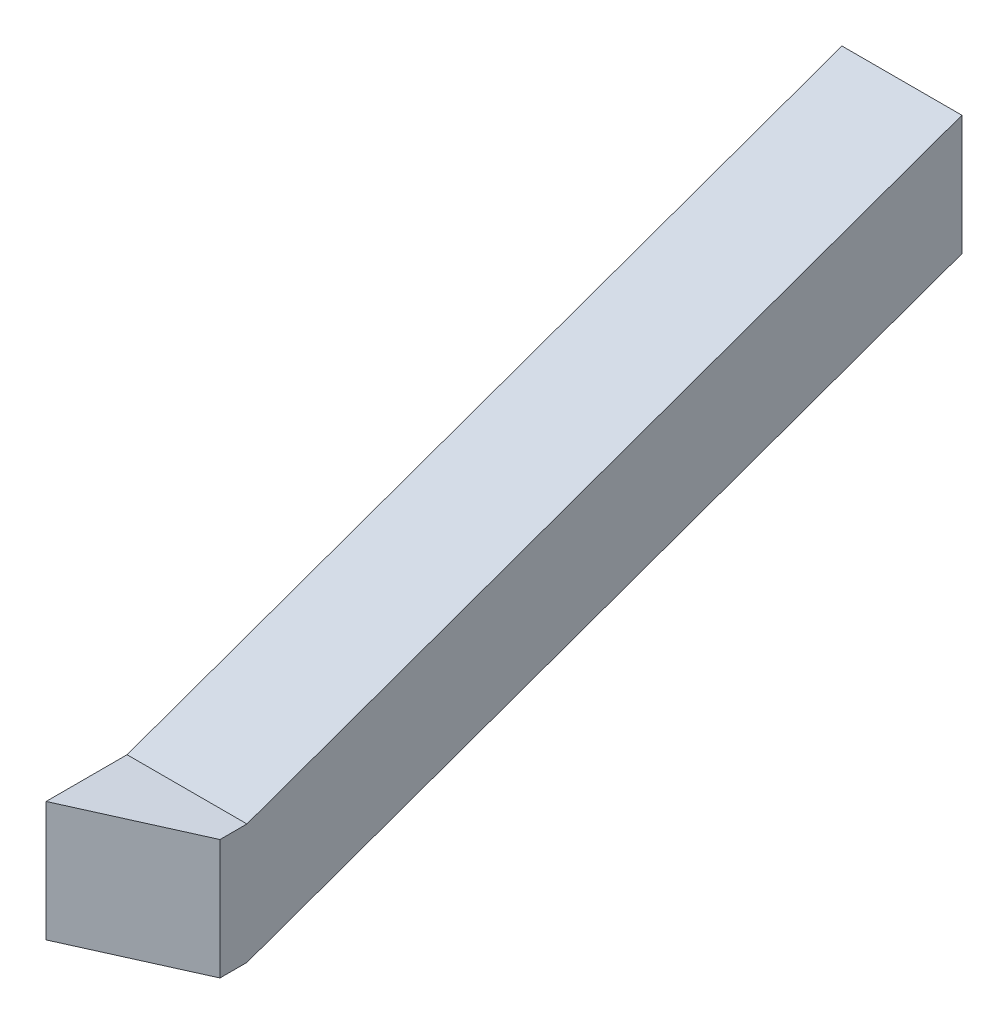
ISO-10303-21;
HEADER;
FILE_DESCRIPTION(('STEP AP214'),'2;1');
FILE_NAME('part.step','',(''),(''),'','','');
FILE_SCHEMA(('AUTOMOTIVE_DESIGN { 1 0 10303 214 1 1 1 1 }'));
ENDSEC;
DATA;
#1=APPLICATION_CONTEXT('core data for automotive mechanical design processes');
#2=APPLICATION_PROTOCOL_DEFINITION('international standard','automotive_design',2000,#1);
#3=PRODUCT_CONTEXT('',#1,'mechanical');
#4=PRODUCT('Part','Part','',(#3));
#5=PRODUCT_RELATED_PRODUCT_CATEGORY('part','',(#4));
#6=PRODUCT_DEFINITION_FORMATION('','',#4);
#7=PRODUCT_DEFINITION_CONTEXT('part definition',#1,'design');
#8=PRODUCT_DEFINITION('design','',#6,#7);
#9=PRODUCT_DEFINITION_SHAPE('','',#8);
#10=(LENGTH_UNIT() NAMED_UNIT(*) SI_UNIT(.MILLI.,.METRE.));
#11=(NAMED_UNIT(*) PLANE_ANGLE_UNIT() SI_UNIT($,.RADIAN.));
#12=(NAMED_UNIT(*) SI_UNIT($,.STERADIAN.) SOLID_ANGLE_UNIT());
#13=UNCERTAINTY_MEASURE_WITH_UNIT(LENGTH_MEASURE(1.E-05),#10,'distance_accuracy_value','');
#14=(GEOMETRIC_REPRESENTATION_CONTEXT(3) GLOBAL_UNCERTAINTY_ASSIGNED_CONTEXT((#13)) GLOBAL_UNIT_ASSIGNED_CONTEXT((#10,
#11,#12)) REPRESENTATION_CONTEXT('',''));
#15=CARTESIAN_POINT('',(0.,0.,0.));
#16=DIRECTION('',(0.,0.,1.));
#17=DIRECTION('',(1.,0.,0.));
#18=AXIS2_PLACEMENT_3D('',#15,#16,#17);
#19=CARTESIAN_POINT('',(0.,0.,-60.));
#20=DIRECTION('',(-1.,0.,0.));
#21=DIRECTION('',(0.,0.,1.));
#22=AXIS2_PLACEMENT_3D('',#19,#20,#21);
#23=PLANE('',#22);
#24=DIRECTION('',(0.,-1.,0.));
#25=VECTOR('',#24,1.);
#26=CARTESIAN_POINT('',(0.,0.,0.));
#27=LINE('',#26,#25);
#28=CARTESIAN_POINT('',(0.,88.9,0.));
#29=VERTEX_POINT('',#28);
#30=CARTESIAN_POINT('',(0.,0.,0.));
#31=VERTEX_POINT('',#30);
#32=EDGE_CURVE('E108',#29,#31,#27,.T.);
#33=ORIENTED_EDGE('',*,*,#32,.F.);
#34=DIRECTION('',(0.,0.,1.));
#35=VECTOR('',#34,1.);
#36=CARTESIAN_POINT('',(0.,88.9,-60.));
#37=LINE('',#36,#35);
#38=CARTESIAN_POINT('',(0.,88.9,-60.));
#39=VERTEX_POINT('',#38);
#40=EDGE_CURVE('E11',#39,#29,#37,.T.);
#41=ORIENTED_EDGE('',*,*,#40,.F.);
#42=DIRECTION('',(0.,-0.337461295829559,0.941339404156139));
#43=VECTOR('',#42,1.);
#44=CARTESIAN_POINT('',(0.,278.9,-590.));
#45=LINE('',#44,#43);
#46=CARTESIAN_POINT('',(0.,278.9,-590.));
#47=VERTEX_POINT('',#46);
#48=EDGE_CURVE('E111',#47,#39,#45,.T.);
#49=ORIENTED_EDGE('',*,*,#48,.F.);
#50=DIRECTION('',(0.,1.,0.));
#51=VECTOR('',#50,1.);
#52=CARTESIAN_POINT('',(0.,278.9,-590.));
#53=LINE('',#52,#51);
#54=CARTESIAN_POINT('',(0.,190.,-590.));
#55=VERTEX_POINT('',#54);
#56=EDGE_CURVE('E119',#55,#47,#53,.T.);
#57=ORIENTED_EDGE('',*,*,#56,.F.);
#58=DIRECTION('',(0.,-0.337461295829559,0.941339404156139));
#59=VECTOR('',#58,1.);
#60=CARTESIAN_POINT('',(0.,190.,-590.));
#61=LINE('',#60,#59);
#62=CARTESIAN_POINT('',(0.,0.,-60.));
#63=VERTEX_POINT('',#62);
#64=EDGE_CURVE('E121',#55,#63,#61,.T.);
#65=ORIENTED_EDGE('',*,*,#64,.T.);
#66=DIRECTION('',(0.,0.,1.));
#67=VECTOR('',#66,1.);
#68=CARTESIAN_POINT('',(0.,0.,-60.));
#69=LINE('',#68,#67);
#70=EDGE_CURVE('E38',#63,#31,#69,.T.);
#71=ORIENTED_EDGE('',*,*,#70,.T.);
#72=EDGE_LOOP('',(#33,#41,#49,#57,#65,#71));
#73=FACE_BOUND('',#72,.T.);
#74=ADVANCED_FACE('F35',(#73),#23,.T.);
#75=CARTESIAN_POINT('',(0.,88.9,-60.));
#76=DIRECTION('',(0.,1.,0.));
#77=DIRECTION('',(0.,0.,1.));
#78=AXIS2_PLACEMENT_3D('',#75,#76,#77);
#79=PLANE('',#78);
#80=DIRECTION('',(-0.911940698035273,0.,0.41032202386289));
#81=VECTOR('',#80,1.);
#82=CARTESIAN_POINT('',(0.,88.9,0.));
#83=LINE('',#82,#81);
#84=CARTESIAN_POINT('',(88.9,88.9,-40.));
#85=VERTEX_POINT('',#84);
#86=EDGE_CURVE('E87',#85,#29,#83,.T.);
#87=ORIENTED_EDGE('',*,*,#86,.F.);
#88=DIRECTION('',(0.,0.,1.));
#89=VECTOR('',#88,1.);
#90=CARTESIAN_POINT('',(88.9,88.9,-60.));
#91=LINE('',#90,#89);
#92=CARTESIAN_POINT('',(88.9,88.9,-60.));
#93=VERTEX_POINT('',#92);
#94=EDGE_CURVE('E44',#93,#85,#91,.T.);
#95=ORIENTED_EDGE('',*,*,#94,.F.);
#96=DIRECTION('',(-1.,0.,0.));
#97=VECTOR('',#96,1.);
#98=CARTESIAN_POINT('',(0.,88.9,-60.));
#99=LINE('',#98,#97);
#100=EDGE_CURVE('E112',#93,#39,#99,.T.);
#101=ORIENTED_EDGE('',*,*,#100,.T.);
#102=ORIENTED_EDGE('',*,*,#40,.T.);
#103=EDGE_LOOP('',(#87,#95,#101,#102));
#104=FACE_BOUND('',#103,.T.);
#105=ADVANCED_FACE('F96',(#104),#79,.T.);
#106=CARTESIAN_POINT('',(88.9,0.,-60.));
#107=DIRECTION('',(1.,0.,0.));
#108=DIRECTION('',(0.,0.,-1.));
#109=AXIS2_PLACEMENT_3D('',#106,#107,#108);
#110=PLANE('',#109);
#111=DIRECTION('',(0.,1.,0.));
#112=VECTOR('',#111,1.);
#113=CARTESIAN_POINT('',(88.9,-11.1,-40.));
#114=LINE('',#113,#112);
#115=CARTESIAN_POINT('',(88.9,0.,-40.));
#116=VERTEX_POINT('',#115);
#117=EDGE_CURVE('E84',#116,#85,#114,.T.);
#118=ORIENTED_EDGE('',*,*,#117,.F.);
#119=DIRECTION('',(0.,0.,1.));
#120=VECTOR('',#119,1.);
#121=CARTESIAN_POINT('',(88.9,0.,-60.));
#122=LINE('',#121,#120);
#123=CARTESIAN_POINT('',(88.9,0.,-60.));
#124=VERTEX_POINT('',#123);
#125=EDGE_CURVE('E105',#124,#116,#122,.T.);
#126=ORIENTED_EDGE('',*,*,#125,.F.);
#127=DIRECTION('',(0.,-0.337461295829559,0.941339404156139));
#128=VECTOR('',#127,1.);
#129=CARTESIAN_POINT('',(88.9,190.,-590.));
#130=LINE('',#129,#128);
#131=CARTESIAN_POINT('',(88.9,190.,-590.));
#132=VERTEX_POINT('',#131);
#133=EDGE_CURVE('E51',#132,#124,#130,.T.);
#134=ORIENTED_EDGE('',*,*,#133,.F.);
#135=DIRECTION('',(0.,-1.,0.));
#136=VECTOR('',#135,1.);
#137=CARTESIAN_POINT('',(88.9,278.9,-590.));
#138=LINE('',#137,#136);
#139=CARTESIAN_POINT('',(88.9,278.9,-590.));
#140=VERTEX_POINT('',#139);
#141=EDGE_CURVE('E129',#140,#132,#138,.T.);
#142=ORIENTED_EDGE('',*,*,#141,.F.);
#143=DIRECTION('',(0.,-0.337461295829559,0.941339404156139));
#144=VECTOR('',#143,1.);
#145=CARTESIAN_POINT('',(88.9,278.9,-590.));
#146=LINE('',#145,#144);
#147=EDGE_CURVE('E104',#140,#93,#146,.T.);
#148=ORIENTED_EDGE('',*,*,#147,.T.);
#149=ORIENTED_EDGE('',*,*,#94,.T.);
#150=EDGE_LOOP('',(#118,#126,#134,#142,#148,#149));
#151=FACE_BOUND('',#150,.T.);
#152=ADVANCED_FACE('F102',(#151),#110,.T.);
#153=CARTESIAN_POINT('',(0.,0.,-60.));
#154=DIRECTION('',(0.,-1.,0.));
#155=DIRECTION('',(0.,0.,-1.));
#156=AXIS2_PLACEMENT_3D('',#153,#154,#155);
#157=PLANE('',#156);
#158=DIRECTION('',(0.911940698035273,0.,-0.41032202386289));
#159=VECTOR('',#158,1.);
#160=CARTESIAN_POINT('',(22.4513611716462,0.,-10.1018497960163));
#161=LINE('',#160,#159);
#162=EDGE_CURVE('E89',#31,#116,#161,.T.);
#163=ORIENTED_EDGE('',*,*,#162,.F.);
#164=ORIENTED_EDGE('',*,*,#70,.F.);
#165=DIRECTION('',(1.,0.,0.));
#166=VECTOR('',#165,1.);
#167=CARTESIAN_POINT('',(0.,0.,-60.));
#168=LINE('',#167,#166);
#169=EDGE_CURVE('E110',#63,#124,#168,.T.);
#170=ORIENTED_EDGE('',*,*,#169,.T.);
#171=ORIENTED_EDGE('',*,*,#125,.T.);
#172=EDGE_LOOP('',(#163,#164,#170,#171));
#173=FACE_BOUND('',#172,.T.);
#174=ADVANCED_FACE('F139',(#173),#157,.T.);
#175=CARTESIAN_POINT('',(0.,190.,-590.));
#176=DIRECTION('',(0.,0.,-1.));
#177=DIRECTION('',(-1.,0.,0.));
#178=AXIS2_PLACEMENT_3D('',#175,#176,#177);
#179=PLANE('',#178);
#180=ORIENTED_EDGE('',*,*,#141,.T.);
#181=DIRECTION('',(-1.,0.,0.));
#182=VECTOR('',#181,1.);
#183=CARTESIAN_POINT('',(88.9,190.,-590.));
#184=LINE('',#183,#182);
#185=EDGE_CURVE('E124',#132,#55,#184,.T.);
#186=ORIENTED_EDGE('',*,*,#185,.T.);
#187=ORIENTED_EDGE('',*,*,#56,.T.);
#188=DIRECTION('',(1.,0.,0.));
#189=VECTOR('',#188,1.);
#190=CARTESIAN_POINT('',(88.9,278.9,-590.));
#191=LINE('',#190,#189);
#192=EDGE_CURVE('E116',#47,#140,#191,.T.);
#193=ORIENTED_EDGE('',*,*,#192,.T.);
#194=EDGE_LOOP('',(#180,#186,#187,#193));
#195=FACE_BOUND('',#194,.T.);
#196=ADVANCED_FACE('F135',(#195),#179,.T.);
#197=CARTESIAN_POINT('',(88.9,190.,-590.));
#198=DIRECTION('',(0.,0.941339404156139,0.337461295829559));
#199=DIRECTION('',(0.,-0.337461295829559,0.941339404156139));
#200=AXIS2_PLACEMENT_3D('',#197,#198,#199);
#201=PLANE('',#200);
#202=ORIENTED_EDGE('',*,*,#64,.F.);
#203=ORIENTED_EDGE('',*,*,#185,.F.);
#204=ORIENTED_EDGE('',*,*,#133,.T.);
#205=ORIENTED_EDGE('',*,*,#169,.F.);
#206=EDGE_LOOP('',(#202,#203,#204,#205));
#207=FACE_BOUND('',#206,.T.);
#208=ADVANCED_FACE('F141',(#207),#201,.F.);
#209=CARTESIAN_POINT('',(88.9,278.9,-590.));
#210=DIRECTION('',(0.,-0.941339404156139,-0.337461295829559));
#211=DIRECTION('',(0.,0.337461295829559,-0.941339404156139));
#212=AXIS2_PLACEMENT_3D('',#209,#210,#211);
#213=PLANE('',#212);
#214=ORIENTED_EDGE('',*,*,#100,.F.);
#215=ORIENTED_EDGE('',*,*,#147,.F.);
#216=ORIENTED_EDGE('',*,*,#192,.F.);
#217=ORIENTED_EDGE('',*,*,#48,.T.);
#218=EDGE_LOOP('',(#214,#215,#216,#217));
#219=FACE_BOUND('',#218,.T.);
#220=ADVANCED_FACE('F145',(#219),#213,.F.);
#221=CARTESIAN_POINT('',(0.,-11.1,0.));
#222=DIRECTION('',(-0.41032202386289,0.,-0.911940698035273));
#223=DIRECTION('',(-0.911940698035273,0.,0.41032202386289));
#224=AXIS2_PLACEMENT_3D('',#221,#222,#223);
#225=PLANE('',#224);
#226=ORIENTED_EDGE('',*,*,#162,.T.);
#227=ORIENTED_EDGE('',*,*,#117,.T.);
#228=ORIENTED_EDGE('',*,*,#86,.T.);
#229=ORIENTED_EDGE('',*,*,#32,.T.);
#230=EDGE_LOOP('',(#226,#227,#228,#229));
#231=FACE_BOUND('',#230,.T.);
#232=ADVANCED_FACE('F86',(#231),#225,.F.);
#233=CLOSED_SHELL('',(#74,#105,#152,#174,#196,#208,#220,#232));
#234=MANIFOLD_SOLID_BREP('B2',#233);
#235=ADVANCED_BREP_SHAPE_REPRESENTATION('',(#18,#234),#14);
#236=SHAPE_DEFINITION_REPRESENTATION(#9,#235);
ENDSEC;
END-ISO-10303-21;
